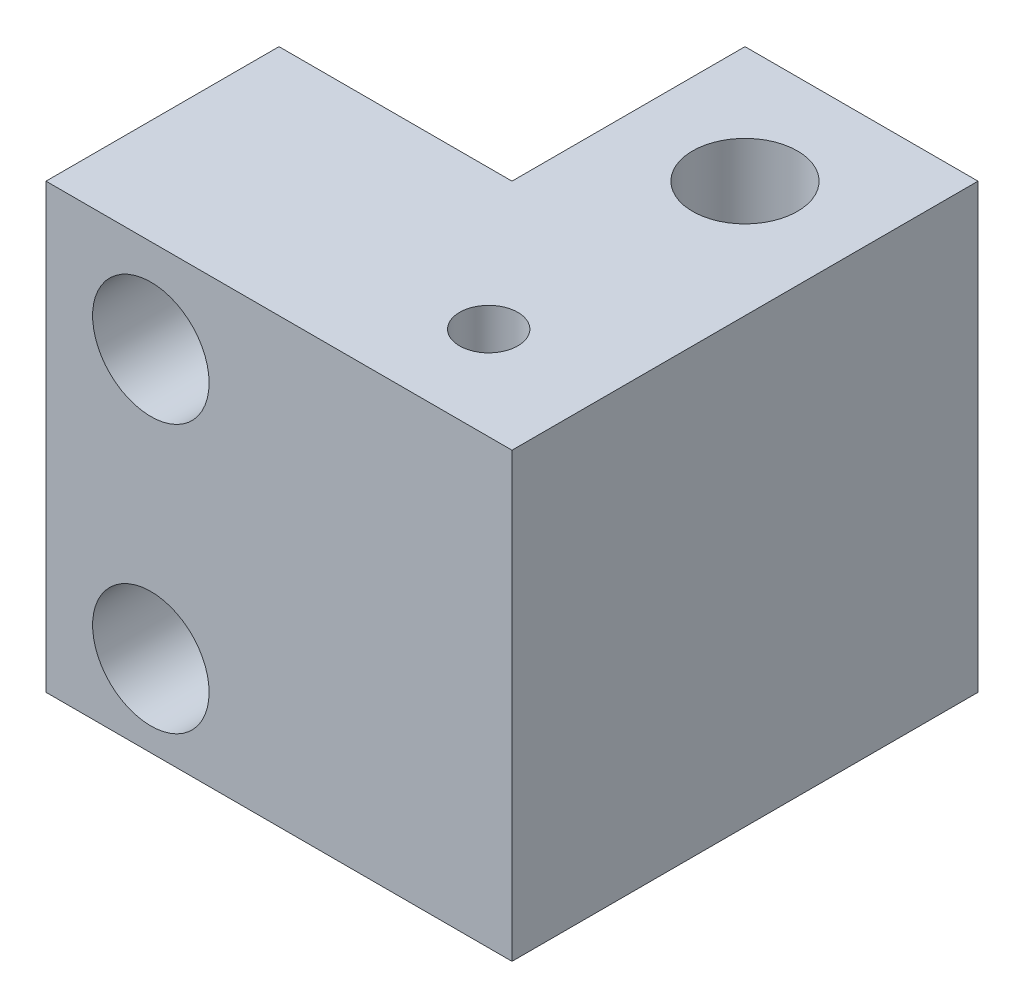
ISO-10303-21;
HEADER;
FILE_DESCRIPTION(('STEP AP214'),'2;1');
FILE_NAME('part.step','',(''),(''),'','','');
FILE_SCHEMA(('AUTOMOTIVE_DESIGN { 1 0 10303 214 1 1 1 1 }'));
ENDSEC;
DATA;
#1=APPLICATION_CONTEXT('core data for automotive mechanical design processes');
#2=APPLICATION_PROTOCOL_DEFINITION('international standard','automotive_design',2000,#1);
#3=PRODUCT_CONTEXT('',#1,'mechanical');
#4=PRODUCT('Part','Part','',(#3));
#5=PRODUCT_RELATED_PRODUCT_CATEGORY('part','',(#4));
#6=PRODUCT_DEFINITION_FORMATION('','',#4);
#7=PRODUCT_DEFINITION_CONTEXT('part definition',#1,'design');
#8=PRODUCT_DEFINITION('design','',#6,#7);
#9=PRODUCT_DEFINITION_SHAPE('','',#8);
#10=(LENGTH_UNIT() NAMED_UNIT(*) SI_UNIT(.MILLI.,.METRE.));
#11=(NAMED_UNIT(*) PLANE_ANGLE_UNIT() SI_UNIT($,.RADIAN.));
#12=(NAMED_UNIT(*) SI_UNIT($,.STERADIAN.) SOLID_ANGLE_UNIT());
#13=UNCERTAINTY_MEASURE_WITH_UNIT(LENGTH_MEASURE(1.E-05),#10,'distance_accuracy_value','');
#14=(GEOMETRIC_REPRESENTATION_CONTEXT(3) GLOBAL_UNCERTAINTY_ASSIGNED_CONTEXT((#13)) GLOBAL_UNIT_ASSIGNED_CONTEXT((#10,
#11,#12)) REPRESENTATION_CONTEXT('',''));
#15=CARTESIAN_POINT('',(0.,0.,0.));
#16=DIRECTION('',(0.,0.,1.));
#17=DIRECTION('',(1.,0.,0.));
#18=AXIS2_PLACEMENT_3D('',#15,#16,#17);
#19=CARTESIAN_POINT('',(-5.,10.75546678755,-5.));
#20=DIRECTION('',(0.,1.,0.));
#21=DIRECTION('',(0.,0.,1.));
#22=AXIS2_PLACEMENT_3D('',#19,#20,#21);
#23=CYLINDRICAL_SURFACE('',#22,2.5);
#24=CARTESIAN_POINT('',(-5.,12.5,-5.));
#25=DIRECTION('',(0.,1.,0.));
#26=DIRECTION('',(0.,0.,-1.));
#27=AXIS2_PLACEMENT_3D('',#24,#25,#26);
#28=CIRCLE('',#27,2.5);
#29=CARTESIAN_POINT('',(-5.,12.5,-7.5));
#30=VERTEX_POINT('',#29);
#31=EDGE_CURVE('P0_E11',#30,#30,#28,.T.);
#32=ORIENTED_EDGE('',*,*,#31,.T.);
#33=CARTESIAN_POINT('',(-5.00000000000001,19.,-7.5));
#34=DIRECTION('',(0.,-1.,0.));
#35=VECTOR('',#34,1.);
#36=LINE('',#33,#35);
#37=CARTESIAN_POINT('',(-5.,19.,-7.5));
#38=VERTEX_POINT('',#37);
#39=EDGE_CURVE('P0_E27',#38,#30,#36,.T.);
#40=ORIENTED_EDGE('',*,*,#39,.F.);
#41=CARTESIAN_POINT('',(-5.,19.,-5.));
#42=DIRECTION('',(0.,-1.,0.));
#43=DIRECTION('',(0.,0.,-1.));
#44=AXIS2_PLACEMENT_3D('',#41,#42,#43);
#45=CIRCLE('',#44,2.5);
#46=EDGE_CURVE('P0_E43',#38,#38,#45,.T.);
#47=ORIENTED_EDGE('',*,*,#46,.T.);
#48=ORIENTED_EDGE('',*,*,#39,.T.);
#49=EDGE_LOOP('',(#32,#40,#47,#48));
#50=FACE_BOUND('',#49,.T.);
#51=ADVANCED_FACE('P0_F16',(#50),#23,.T.);
#52=CARTESIAN_POINT('',(-5.,12.5,-5.));
#53=DIRECTION('',(0.,1.,0.));
#54=DIRECTION('',(1.,0.,0.));
#55=AXIS2_PLACEMENT_3D('',#52,#53,#54);
#56=PLANE('',#55);
#57=ORIENTED_EDGE('',*,*,#31,.F.);
#58=EDGE_LOOP('',(#57));
#59=FACE_BOUND('',#58,.T.);
#60=CARTESIAN_POINT('',(-2.75,12.5,-5.));
#61=CARTESIAN_POINT('',(-2.75,12.5,-5.42973854945374));
#62=CARTESIAN_POINT('',(-2.90797632260953,12.5,-5.82821309651421));
#63=CARTESIAN_POINT('',(-3.08010532429531,12.5,-6.26238591969255));
#64=CARTESIAN_POINT('',(-3.40900974233027,12.5,-6.59099025766973));
#65=CARTESIAN_POINT('',(-3.73935728169476,12.5,-6.92103640032665));
#66=CARTESIAN_POINT('',(-4.17178690348579,12.5,-7.09202367739047));
#67=CARTESIAN_POINT('',(-4.5718045358175,12.5,-7.25019490869194));
#68=CARTESIAN_POINT('',(-5.,12.5,-7.25));
#69=CARTESIAN_POINT('',(-5.43023270318849,12.5,-7.24980416398486));
#70=CARTESIAN_POINT('',(-5.82821309651422,12.5,-7.09202367739047));
#71=CARTESIAN_POINT('',(-6.26238605069376,12.5,-6.91989454458542));
#72=CARTESIAN_POINT('',(-6.59099025766973,12.5,-6.59099025766973));
#73=CARTESIAN_POINT('',(-6.92103640338351,12.5,-6.26064271524402));
#74=CARTESIAN_POINT('',(-7.09202367739047,12.5,-5.82821309651422));
#75=CARTESIAN_POINT('',(-7.25,12.5,-5.4286883871397));
#76=CARTESIAN_POINT('',(-7.25,12.5,-5.));
#77=B_SPLINE_CURVE_WITH_KNOTS('',2,(#60,#61,#62,#63,#64,#65,#66,#67,#68,#69,#70,#71,#72,#73,#74,
#75,#76),.UNSPECIFIED.,.F.,.F.,(3,2,2,2,2,2,2,2,3),(0.,0.125,0.25,0.375,0.5,0.625,0.75,0.875,
1.),.UNSPECIFIED.);
#78=CARTESIAN_POINT('',(-7.25,12.5,-5.));
#79=VERTEX_POINT('',#78);
#80=CARTESIAN_POINT('',(-2.75,12.5,-5.));
#81=VERTEX_POINT('',#80);
#82=EDGE_CURVE('P0_E44',#79,#81,#77,.F.);
#83=ORIENTED_EDGE('',*,*,#82,.F.);
#84=CARTESIAN_POINT('',(-7.25,12.5,-5.));
#85=CARTESIAN_POINT('',(-7.25,12.5,-4.57026145054504));
#86=CARTESIAN_POINT('',(-7.09202367739047,12.5,-4.17178690348578));
#87=CARTESIAN_POINT('',(-6.91989467570396,12.5,-3.73761408030693));
#88=CARTESIAN_POINT('',(-6.59099025766973,12.5,-3.40900974233027));
#89=CARTESIAN_POINT('',(-6.2606427183041,12.5,-3.078963599672));
#90=CARTESIAN_POINT('',(-5.82821309651421,12.5,-2.90797632260953));
#91=CARTESIAN_POINT('',(-5.42819546417947,12.5,-2.7498050913077));
#92=CARTESIAN_POINT('',(-5.,12.5,-2.75));
#93=CARTESIAN_POINT('',(-4.56976729681021,12.5,-2.75019583601551));
#94=CARTESIAN_POINT('',(-4.17178690348579,12.5,-2.90797632260953));
#95=CARTESIAN_POINT('',(-3.73761394930923,12.5,-3.08010545541356));
#96=CARTESIAN_POINT('',(-3.40900974233027,12.5,-3.40900974233027));
#97=CARTESIAN_POINT('',(-3.07896359661796,12.5,-3.73935728475253));
#98=CARTESIAN_POINT('',(-2.90797632260953,12.5,-4.17178690348579));
#99=CARTESIAN_POINT('',(-2.75,12.5,-4.57131161286009));
#100=CARTESIAN_POINT('',(-2.75,12.5,-5.));
#101=B_SPLINE_CURVE_WITH_KNOTS('',2,(#84,#85,#86,#87,#88,#89,#90,#91,#92,#93,#94,#95,#96,#97,
#98,#99,#100),.UNSPECIFIED.,.F.,.F.,(3,2,2,2,2,2,2,2,3),(0.,0.125,0.25,0.375,0.5,0.625,0.75,
0.875,1.),.UNSPECIFIED.);
#102=EDGE_CURVE('P0_E39',#81,#79,#101,.F.);
#103=ORIENTED_EDGE('',*,*,#102,.F.);
#104=EDGE_LOOP('',(#83,#103));
#105=FACE_BOUND('',#104,.T.);
#106=ADVANCED_FACE('P0_F17',(#59,#105),#56,.F.);
#107=OPEN_SHELL('',(#51,#106));
#108=SHELL_BASED_SURFACE_MODEL('P0_B1',(#107));
#109=CARTESIAN_POINT('',(-5.,12.43637043753,6.));
#110=DIRECTION('',(0.,1.,0.));
#111=DIRECTION('',(0.,0.,1.));
#112=AXIS2_PLACEMENT_3D('',#109,#110,#111);
#113=CYLINDRICAL_SURFACE('',#112,1.5);
#114=CARTESIAN_POINT('',(-5.,13.5,6.));
#115=DIRECTION('',(0.,1.,0.));
#116=DIRECTION('',(0.,0.,-1.));
#117=AXIS2_PLACEMENT_3D('',#114,#115,#116);
#118=CIRCLE('',#117,1.5);
#119=CARTESIAN_POINT('',(-5.,13.5,4.5));
#120=VERTEX_POINT('',#119);
#121=EDGE_CURVE('P1_E11',#120,#120,#118,.T.);
#122=ORIENTED_EDGE('',*,*,#121,.T.);
#123=CARTESIAN_POINT('',(-5.,19.,4.5));
#124=DIRECTION('',(0.,-1.,0.));
#125=VECTOR('',#124,1.);
#126=LINE('',#123,#125);
#127=CARTESIAN_POINT('',(-5.,19.,4.5));
#128=VERTEX_POINT('',#127);
#129=EDGE_CURVE('P1_E27',#128,#120,#126,.T.);
#130=ORIENTED_EDGE('',*,*,#129,.F.);
#131=CARTESIAN_POINT('',(-5.,19.,6.));
#132=DIRECTION('',(0.,-1.,0.));
#133=DIRECTION('',(0.,0.,-1.));
#134=AXIS2_PLACEMENT_3D('',#131,#132,#133);
#135=CIRCLE('',#134,1.5);
#136=EDGE_CURVE('P1_E43',#128,#128,#135,.T.);
#137=ORIENTED_EDGE('',*,*,#136,.T.);
#138=ORIENTED_EDGE('',*,*,#129,.T.);
#139=EDGE_LOOP('',(#122,#130,#137,#138));
#140=FACE_BOUND('',#139,.T.);
#141=ADVANCED_FACE('P1_F16',(#140),#113,.T.);
#142=CARTESIAN_POINT('',(-5.,13.5,6.));
#143=DIRECTION('',(0.,1.,0.));
#144=DIRECTION('',(1.,0.,0.));
#145=AXIS2_PLACEMENT_3D('',#142,#143,#144);
#146=PLANE('',#145);
#147=ORIENTED_EDGE('',*,*,#121,.F.);
#148=EDGE_LOOP('',(#147));
#149=FACE_BOUND('',#148,.T.);
#150=CARTESIAN_POINT('',(-3.75,13.5,6.));
#151=CARTESIAN_POINT('',(-3.75,13.5,5.76100564294309));
#152=CARTESIAN_POINT('',(-3.83776462367196,13.5,5.53988161304766));
#153=CARTESIAN_POINT('',(-3.93365902356337,13.5,5.29827451372653));
#154=CARTESIAN_POINT('',(-4.11611652351681,13.5,5.11611652351681));
#155=CARTESIAN_POINT('',(-4.30001758597357,13.5,4.93251734045716));
#156=CARTESIAN_POINT('',(-4.53988161304766,13.5,4.83776462367196));
#157=CARTESIAN_POINT('',(-4.76254795374342,13.5,4.7498054537418));
#158=CARTESIAN_POINT('',(-5.,13.5,4.75));
#159=CARTESIAN_POINT('',(-5.23948905399546,13.5,4.75019621519406));
#160=CARTESIAN_POINT('',(-5.46011838695234,13.5,4.83776462367196));
#161=CARTESIAN_POINT('',(-5.70172572372918,13.5,4.93365926140931));
#162=CARTESIAN_POINT('',(-5.88388347648319,13.5,5.11611652351681));
#163=CARTESIAN_POINT('',(-6.06748266432252,13.5,5.30001759076134));
#164=CARTESIAN_POINT('',(-6.16223537632804,13.5,5.53988161304766));
#165=CARTESIAN_POINT('',(-6.25,13.5,5.76205547174604));
#166=CARTESIAN_POINT('',(-6.25,13.5,6.));
#167=B_SPLINE_CURVE_WITH_KNOTS('',2,(#150,#151,#152,#153,#154,#155,#156,#157,#158,#159,#160,
#161,#162,#163,#164,#165,#166),.UNSPECIFIED.,.F.,.F.,(3,2,2,2,2,2,2,2,3),(0.,0.125,0.25,0.375,
0.5,0.625,0.75,0.875,1.),.UNSPECIFIED.);
#168=CARTESIAN_POINT('',(-6.25,13.5,6.));
#169=VERTEX_POINT('',#168);
#170=CARTESIAN_POINT('',(-3.75,13.5,6.));
#171=VERTEX_POINT('',#170);
#172=EDGE_CURVE('P1_E44',#169,#171,#167,.F.);
#173=ORIENTED_EDGE('',*,*,#172,.F.);
#174=CARTESIAN_POINT('',(-6.25,13.5,6.));
#175=CARTESIAN_POINT('',(-6.25,13.5,6.23899435706058));
#176=CARTESIAN_POINT('',(-6.16223537632804,13.5,6.46011838695234));
#177=CARTESIAN_POINT('',(-6.06634097643341,13.5,6.70172548627756));
#178=CARTESIAN_POINT('',(-5.88388347648318,13.5,6.88388347648319));
#179=CARTESIAN_POINT('',(-5.69998241402487,13.5,7.06748265954348));
#180=CARTESIAN_POINT('',(-5.46011838695234,13.5,7.16223537632804));
#181=CARTESIAN_POINT('',(-5.23745204625651,13.5,7.25019454625821));
#182=CARTESIAN_POINT('',(-5.,13.5,7.25));
#183=CARTESIAN_POINT('',(-4.76051094600391,13.5,7.24980378480594));
#184=CARTESIAN_POINT('',(-4.53988161304766,13.5,7.16223537632804));
#185=CARTESIAN_POINT('',(-4.29827427626999,13.5,7.06634073859009));
#186=CARTESIAN_POINT('',(-4.11611652351682,13.5,6.88388347648319));
#187=CARTESIAN_POINT('',(-3.93251733567698,13.5,6.69998240923792));
#188=CARTESIAN_POINT('',(-3.83776462367196,13.5,6.46011838695234));
#189=CARTESIAN_POINT('',(-3.75,13.5,6.23794452825349));
#190=CARTESIAN_POINT('',(-3.75,13.5,6.));
#191=B_SPLINE_CURVE_WITH_KNOTS('',2,(#174,#175,#176,#177,#178,#179,#180,#181,#182,#183,#184,
#185,#186,#187,#188,#189,#190),.UNSPECIFIED.,.F.,.F.,(3,2,2,2,2,2,2,2,3),(0.,0.125,0.25,0.375,
0.5,0.625,0.75,0.875,1.),.UNSPECIFIED.);
#192=EDGE_CURVE('P1_E39',#171,#169,#191,.F.);
#193=ORIENTED_EDGE('',*,*,#192,.F.);
#194=EDGE_LOOP('',(#173,#193));
#195=FACE_BOUND('',#194,.T.);
#196=ADVANCED_FACE('P1_F17',(#149,#195),#146,.F.);
#197=OPEN_SHELL('',(#141,#196));
#198=SHELL_BASED_SURFACE_MODEL('P1_B1',(#197));
#199=CARTESIAN_POINT('',(-20.,19.,0.));
#200=DIRECTION('',(-1.,0.,0.));
#201=DIRECTION('',(0.,0.,1.));
#202=AXIS2_PLACEMENT_3D('',#199,#200,#201);
#203=PLANE('',#202);
#204=DIRECTION('',(0.,0.,1.));
#205=VECTOR('',#204,1.);
#206=CARTESIAN_POINT('',(-20.,19.,0.));
#207=LINE('',#206,#205);
#208=CARTESIAN_POINT('',(-20.,19.,0.));
#209=VERTEX_POINT('',#208);
#210=CARTESIAN_POINT('',(-20.,19.,10.));
#211=VERTEX_POINT('',#210);
#212=EDGE_CURVE('P2_E131',#209,#211,#207,.T.);
#213=ORIENTED_EDGE('',*,*,#212,.F.);
#214=DIRECTION('',(0.,-1.,0.));
#215=VECTOR('',#214,1.);
#216=CARTESIAN_POINT('',(-20.,0.,0.));
#217=LINE('',#216,#215);
#218=CARTESIAN_POINT('',(-20.,0.,0.));
#219=VERTEX_POINT('',#218);
#220=EDGE_CURVE('P2_E28',#209,#219,#217,.T.);
#221=ORIENTED_EDGE('',*,*,#220,.T.);
#222=DIRECTION('',(0.,0.,-1.));
#223=VECTOR('',#222,1.);
#224=CARTESIAN_POINT('',(-20.,0.,0.));
#225=LINE('',#224,#223);
#226=CARTESIAN_POINT('',(-20.,0.,10.));
#227=VERTEX_POINT('',#226);
#228=EDGE_CURVE('P2_E134',#227,#219,#225,.T.);
#229=ORIENTED_EDGE('',*,*,#228,.F.);
#230=DIRECTION('',(0.,-1.,0.));
#231=VECTOR('',#230,1.);
#232=CARTESIAN_POINT('',(-20.,0.,10.));
#233=LINE('',#232,#231);
#234=EDGE_CURVE('P2_E130',#211,#227,#233,.T.);
#235=ORIENTED_EDGE('',*,*,#234,.F.);
#236=EDGE_LOOP('',(#213,#221,#229,#235));
#237=FACE_BOUND('',#236,.T.);
#238=ADVANCED_FACE('P2_F17',(#237),#203,.T.);
#239=CARTESIAN_POINT('',(-10.,0.,0.));
#240=DIRECTION('',(-1.,0.,0.));
#241=DIRECTION('',(0.,0.,1.));
#242=AXIS2_PLACEMENT_3D('',#239,#240,#241);
#243=PLANE('',#242);
#244=DIRECTION('',(0.,0.,-1.));
#245=VECTOR('',#244,1.);
#246=CARTESIAN_POINT('',(-10.,0.,0.));
#247=LINE('',#246,#245);
#248=CARTESIAN_POINT('',(-10.,0.,0.));
#249=VERTEX_POINT('',#248);
#250=CARTESIAN_POINT('',(-10.,0.,-10.));
#251=VERTEX_POINT('',#250);
#252=EDGE_CURVE('P2_E122',#249,#251,#247,.T.);
#253=ORIENTED_EDGE('',*,*,#252,.F.);
#254=DIRECTION('',(0.,1.,0.));
#255=VECTOR('',#254,1.);
#256=CARTESIAN_POINT('',(-10.,0.,0.));
#257=LINE('',#256,#255);
#258=CARTESIAN_POINT('',(-10.,19.,0.));
#259=VERTEX_POINT('',#258);
#260=EDGE_CURVE('P2_E11',#249,#259,#257,.T.);
#261=ORIENTED_EDGE('',*,*,#260,.T.);
#262=DIRECTION('',(0.,0.,1.));
#263=VECTOR('',#262,1.);
#264=CARTESIAN_POINT('',(-10.,19.,0.));
#265=LINE('',#264,#263);
#266=CARTESIAN_POINT('',(-10.,19.,-10.));
#267=VERTEX_POINT('',#266);
#268=EDGE_CURVE('P2_E154',#267,#259,#265,.T.);
#269=ORIENTED_EDGE('',*,*,#268,.F.);
#270=DIRECTION('',(0.,1.,0.));
#271=VECTOR('',#270,1.);
#272=CARTESIAN_POINT('',(-10.,0.,-10.));
#273=LINE('',#272,#271);
#274=EDGE_CURVE('P2_E172',#251,#267,#273,.T.);
#275=ORIENTED_EDGE('',*,*,#274,.F.);
#276=EDGE_LOOP('',(#253,#261,#269,#275));
#277=FACE_BOUND('',#276,.T.);
#278=ADVANCED_FACE('P2_F277',(#277),#243,.T.);
#279=CARTESIAN_POINT('',(0.,0.,0.));
#280=DIRECTION('',(0.,0.,1.));
#281=DIRECTION('',(1.,0.,0.));
#282=AXIS2_PLACEMENT_3D('',#279,#280,#281);
#283=PLANE('',#282);
#284=CARTESIAN_POINT('',(-15.5,3.5,0.));
#285=DIRECTION('',(0.,0.,-1.));
#286=DIRECTION('',(-1.,0.,0.));
#287=AXIS2_PLACEMENT_3D('',#284,#285,#286);
#288=CIRCLE('',#287,2.5);
#289=CARTESIAN_POINT('',(-13.,3.5,0.));
#290=VERTEX_POINT('',#289);
#291=EDGE_CURVE('P2_E206',#290,#290,#288,.T.);
#292=ORIENTED_EDGE('',*,*,#291,.F.);
#293=EDGE_LOOP('',(#292));
#294=FACE_BOUND('',#293,.T.);
#295=CARTESIAN_POINT('',(-15.5,15.,0.));
#296=DIRECTION('',(0.,0.,-1.));
#297=DIRECTION('',(-1.,0.,0.));
#298=AXIS2_PLACEMENT_3D('',#295,#296,#297);
#299=CIRCLE('',#298,2.5);
#300=CARTESIAN_POINT('',(-13.,15.,0.));
#301=VERTEX_POINT('',#300);
#302=EDGE_CURVE('P2_E21',#301,#301,#299,.T.);
#303=ORIENTED_EDGE('',*,*,#302,.F.);
#304=EDGE_LOOP('',(#303));
#305=FACE_BOUND('',#304,.T.);
#306=ORIENTED_EDGE('',*,*,#220,.F.);
#307=DIRECTION('',(-1.,0.,0.));
#308=VECTOR('',#307,1.);
#309=CARTESIAN_POINT('',(0.,19.,0.));
#310=LINE('',#309,#308);
#311=EDGE_CURVE('P2_E147',#259,#209,#310,.T.);
#312=ORIENTED_EDGE('',*,*,#311,.F.);
#313=ORIENTED_EDGE('',*,*,#260,.F.);
#314=DIRECTION('',(1.,0.,0.));
#315=VECTOR('',#314,1.);
#316=CARTESIAN_POINT('',(-20.,0.,0.));
#317=LINE('',#316,#315);
#318=EDGE_CURVE('P2_E211',#219,#249,#317,.T.);
#319=ORIENTED_EDGE('',*,*,#318,.F.);
#320=EDGE_LOOP('',(#306,#312,#313,#319));
#321=FACE_BOUND('',#320,.T.);
#322=ADVANCED_FACE('P2_F282',(#294,#305,#321),#283,.F.);
#323=CARTESIAN_POINT('',(0.,0.,10.));
#324=DIRECTION('',(0.,0.,1.));
#325=DIRECTION('',(1.,0.,0.));
#326=AXIS2_PLACEMENT_3D('',#323,#324,#325);
#327=PLANE('',#326);
#328=CARTESIAN_POINT('',(-15.5,3.5,10.));
#329=DIRECTION('',(0.,0.,-1.));
#330=DIRECTION('',(-1.,0.,0.));
#331=AXIS2_PLACEMENT_3D('',#328,#329,#330);
#332=CIRCLE('',#331,2.5);
#333=CARTESIAN_POINT('',(-13.,3.5,10.));
#334=VERTEX_POINT('',#333);
#335=EDGE_CURVE('P2_E240',#334,#334,#332,.T.);
#336=ORIENTED_EDGE('',*,*,#335,.T.);
#337=EDGE_LOOP('',(#336));
#338=FACE_BOUND('',#337,.T.);
#339=CARTESIAN_POINT('',(-15.5,15.,10.));
#340=DIRECTION('',(0.,0.,-1.));
#341=DIRECTION('',(-1.,0.,0.));
#342=AXIS2_PLACEMENT_3D('',#339,#340,#341);
#343=CIRCLE('',#342,2.5);
#344=CARTESIAN_POINT('',(-13.,15.,10.));
#345=VERTEX_POINT('',#344);
#346=EDGE_CURVE('P2_E189',#345,#345,#343,.T.);
#347=ORIENTED_EDGE('',*,*,#346,.T.);
#348=EDGE_LOOP('',(#347));
#349=FACE_BOUND('',#348,.T.);
#350=DIRECTION('',(-1.,0.,0.));
#351=VECTOR('',#350,1.);
#352=CARTESIAN_POINT('',(-20.,0.,10.));
#353=LINE('',#352,#351);
#354=CARTESIAN_POINT('',(0.,0.,10.));
#355=VERTEX_POINT('',#354);
#356=EDGE_CURVE('P2_E174',#355,#227,#353,.T.);
#357=ORIENTED_EDGE('',*,*,#356,.F.);
#358=DIRECTION('',(0.,-1.,0.));
#359=VECTOR('',#358,1.);
#360=CARTESIAN_POINT('',(0.,0.,10.));
#361=LINE('',#360,#359);
#362=CARTESIAN_POINT('',(0.,19.,10.));
#363=VERTEX_POINT('',#362);
#364=EDGE_CURVE('P2_E141',#363,#355,#361,.T.);
#365=ORIENTED_EDGE('',*,*,#364,.F.);
#366=DIRECTION('',(1.,0.,0.));
#367=VECTOR('',#366,1.);
#368=CARTESIAN_POINT('',(0.,19.,10.));
#369=LINE('',#368,#367);
#370=EDGE_CURVE('P2_E96',#211,#363,#369,.T.);
#371=ORIENTED_EDGE('',*,*,#370,.F.);
#372=ORIENTED_EDGE('',*,*,#234,.T.);
#373=EDGE_LOOP('',(#357,#365,#371,#372));
#374=FACE_BOUND('',#373,.T.);
#375=ADVANCED_FACE('P2_F139',(#338,#349,#374),#327,.T.);
#376=CARTESIAN_POINT('',(-20.,0.,0.));
#377=DIRECTION('',(0.,-1.,0.));
#378=DIRECTION('',(0.,0.,-1.));
#379=AXIS2_PLACEMENT_3D('',#376,#377,#378);
#380=PLANE('',#379);
#381=DIRECTION('',(-1.,0.,0.));
#382=VECTOR('',#381,1.);
#383=CARTESIAN_POINT('',(0.,0.,-10.));
#384=LINE('',#383,#382);
#385=CARTESIAN_POINT('',(0.,0.,-10.));
#386=VERTEX_POINT('',#385);
#387=EDGE_CURVE('P2_E175',#386,#251,#384,.T.);
#388=ORIENTED_EDGE('',*,*,#387,.F.);
#389=DIRECTION('',(0.,0.,-1.));
#390=VECTOR('',#389,1.);
#391=CARTESIAN_POINT('',(0.,0.,0.));
#392=LINE('',#391,#390);
#393=EDGE_CURVE('P2_E168',#355,#386,#392,.T.);
#394=ORIENTED_EDGE('',*,*,#393,.F.);
#395=ORIENTED_EDGE('',*,*,#356,.T.);
#396=ORIENTED_EDGE('',*,*,#228,.T.);
#397=ORIENTED_EDGE('',*,*,#318,.T.);
#398=ORIENTED_EDGE('',*,*,#252,.T.);
#399=EDGE_LOOP('',(#388,#394,#395,#396,#397,#398));
#400=FACE_BOUND('',#399,.T.);
#401=ADVANCED_FACE('P2_F290',(#400),#380,.T.);
#402=CARTESIAN_POINT('',(0.,0.,-10.));
#403=DIRECTION('',(0.,0.,-1.));
#404=DIRECTION('',(0.,-1.,0.));
#405=AXIS2_PLACEMENT_3D('',#402,#403,#404);
#406=PLANE('',#405);
#407=ORIENTED_EDGE('',*,*,#387,.T.);
#408=ORIENTED_EDGE('',*,*,#274,.T.);
#409=DIRECTION('',(-1.,0.,0.));
#410=VECTOR('',#409,1.);
#411=CARTESIAN_POINT('',(0.,19.,-10.));
#412=LINE('',#411,#410);
#413=CARTESIAN_POINT('',(0.,19.,-10.));
#414=VERTEX_POINT('',#413);
#415=EDGE_CURVE('P2_E108',#414,#267,#412,.T.);
#416=ORIENTED_EDGE('',*,*,#415,.F.);
#417=DIRECTION('',(0.,1.,0.));
#418=VECTOR('',#417,1.);
#419=CARTESIAN_POINT('',(0.,0.,-10.));
#420=LINE('',#419,#418);
#421=EDGE_CURVE('P2_E166',#386,#414,#420,.T.);
#422=ORIENTED_EDGE('',*,*,#421,.F.);
#423=EDGE_LOOP('',(#407,#408,#416,#422));
#424=FACE_BOUND('',#423,.T.);
#425=ADVANCED_FACE('P2_F293',(#424),#406,.T.);
#426=CARTESIAN_POINT('',(0.,19.,0.));
#427=DIRECTION('',(0.,1.,0.));
#428=DIRECTION('',(1.,0.,0.));
#429=AXIS2_PLACEMENT_3D('',#426,#427,#428);
#430=PLANE('',#429);
#431=CARTESIAN_POINT('',(-5.,19.,-5.));
#432=DIRECTION('',(0.,-1.,0.));
#433=DIRECTION('',(0.,0.,1.));
#434=AXIS2_PLACEMENT_3D('',#431,#432,#433);
#435=CIRCLE('',#434,2.25);
#436=CARTESIAN_POINT('',(-5.,19.,-7.25));
#437=VERTEX_POINT('',#436);
#438=EDGE_CURVE('P2_E179',#437,#437,#435,.T.);
#439=ORIENTED_EDGE('',*,*,#438,.T.);
#440=EDGE_LOOP('',(#439));
#441=FACE_BOUND('',#440,.T.);
#442=CARTESIAN_POINT('',(-5.,19.,6.));
#443=DIRECTION('',(0.,-1.,0.));
#444=DIRECTION('',(0.,0.,1.));
#445=AXIS2_PLACEMENT_3D('',#442,#443,#444);
#446=CIRCLE('',#445,1.25);
#447=CARTESIAN_POINT('',(-5.,19.,4.75));
#448=VERTEX_POINT('',#447);
#449=EDGE_CURVE('P2_E192',#448,#448,#446,.T.);
#450=ORIENTED_EDGE('',*,*,#449,.T.);
#451=EDGE_LOOP('',(#450));
#452=FACE_BOUND('',#451,.T.);
#453=ORIENTED_EDGE('',*,*,#268,.T.);
#454=ORIENTED_EDGE('',*,*,#311,.T.);
#455=ORIENTED_EDGE('',*,*,#212,.T.);
#456=ORIENTED_EDGE('',*,*,#370,.T.);
#457=DIRECTION('',(0.,0.,1.));
#458=VECTOR('',#457,1.);
#459=CARTESIAN_POINT('',(0.,19.,0.));
#460=LINE('',#459,#458);
#461=EDGE_CURVE('P2_E202',#414,#363,#460,.T.);
#462=ORIENTED_EDGE('',*,*,#461,.F.);
#463=ORIENTED_EDGE('',*,*,#415,.T.);
#464=EDGE_LOOP('',(#453,#454,#455,#456,#462,#463));
#465=FACE_BOUND('',#464,.T.);
#466=ADVANCED_FACE('P2_F146',(#441,#452,#465),#430,.T.);
#467=CARTESIAN_POINT('',(0.,0.,0.));
#468=DIRECTION('',(1.,0.,0.));
#469=DIRECTION('',(0.,1.,0.));
#470=AXIS2_PLACEMENT_3D('',#467,#468,#469);
#471=PLANE('',#470);
#472=ORIENTED_EDGE('',*,*,#421,.T.);
#473=ORIENTED_EDGE('',*,*,#461,.T.);
#474=ORIENTED_EDGE('',*,*,#364,.T.);
#475=ORIENTED_EDGE('',*,*,#393,.T.);
#476=EDGE_LOOP('',(#472,#473,#474,#475));
#477=FACE_BOUND('',#476,.T.);
#478=ADVANCED_FACE('P2_F273',(#477),#471,.T.);
#479=CARTESIAN_POINT('',(-5.,12.4999999999886,-5.));
#480=DIRECTION('',(0.,1.,0.));
#481=DIRECTION('',(0.,0.,1.));
#482=AXIS2_PLACEMENT_3D('',#479,#480,#481);
#483=CONICAL_SURFACE('',#482,2.25000000000819,1.02974425858935);
#484=DIRECTION('',(0.,0.515038074984888,-0.857167300657148));
#485=VECTOR('',#484,1.);
#486=CARTESIAN_POINT('',(-5.,12.4999999999886,-7.25000000000819));
#487=LINE('',#486,#485);
#488=CARTESIAN_POINT('',(-5.,11.1480636069044,-5.));
#489=VERTEX_POINT('',#488);
#490=CARTESIAN_POINT('',(-5.,12.5,-7.25));
#491=VERTEX_POINT('',#490);
#492=EDGE_CURVE('P2_E162',#489,#491,#487,.T.);
#493=ORIENTED_EDGE('',*,*,#492,.T.);
#494=CARTESIAN_POINT('',(-5.,12.5,-5.));
#495=DIRECTION('',(0.,1.,0.));
#496=DIRECTION('',(0.,0.,1.));
#497=AXIS2_PLACEMENT_3D('',#494,#495,#496);
#498=CIRCLE('',#497,2.25);
#499=EDGE_CURVE('P2_E180',#491,#491,#498,.T.);
#500=ORIENTED_EDGE('',*,*,#499,.T.);
#501=ORIENTED_EDGE('',*,*,#492,.F.);
#502=EDGE_LOOP('',(#493,#500,#501));
#503=FACE_BOUND('',#502,.T.);
#504=ADVANCED_FACE('P2_F19',(#503),#483,.F.);
#505=CARTESIAN_POINT('',(-5.,13.4999999999081,6.));
#506=DIRECTION('',(0.,1.,0.));
#507=DIRECTION('',(0.,0.,1.));
#508=AXIS2_PLACEMENT_3D('',#505,#506,#507);
#509=CONICAL_SURFACE('',#508,1.24999999980446,1.02974425847106);
#510=DIRECTION('',(0.,0.515038075086286,-0.857167300596222));
#511=VECTOR('',#510,1.);
#512=CARTESIAN_POINT('',(-5.,13.4999999999081,4.75000000019554));
#513=LINE('',#512,#511);
#514=CARTESIAN_POINT('',(-5.,12.7489242258914,6.));
#515=VERTEX_POINT('',#514);
#516=CARTESIAN_POINT('',(-5.,13.5,4.75));
#517=VERTEX_POINT('',#516);
#518=EDGE_CURVE('P2_E167',#515,#517,#513,.T.);
#519=ORIENTED_EDGE('',*,*,#518,.T.);
#520=CARTESIAN_POINT('',(-5.,13.5,6.));
#521=DIRECTION('',(0.,1.,0.));
#522=DIRECTION('',(0.,0.,1.));
#523=AXIS2_PLACEMENT_3D('',#520,#521,#522);
#524=CIRCLE('',#523,1.25);
#525=EDGE_CURVE('P2_E157',#517,#517,#524,.T.);
#526=ORIENTED_EDGE('',*,*,#525,.T.);
#527=ORIENTED_EDGE('',*,*,#518,.F.);
#528=EDGE_LOOP('',(#519,#526,#527));
#529=FACE_BOUND('',#528,.T.);
#530=ADVANCED_FACE('P2_F262',(#529),#509,.F.);
#531=CARTESIAN_POINT('',(-15.5,3.5,10.));
#532=DIRECTION('',(0.,0.,-1.));
#533=DIRECTION('',(-1.,0.,0.));
#534=AXIS2_PLACEMENT_3D('',#531,#532,#533);
#535=CYLINDRICAL_SURFACE('',#534,2.5);
#536=ORIENTED_EDGE('',*,*,#335,.F.);
#537=DIRECTION('',(0.,0.,-1.));
#538=VECTOR('',#537,1.);
#539=CARTESIAN_POINT('',(-13.,3.5,10.));
#540=LINE('',#539,#538);
#541=EDGE_CURVE('P2_E232',#334,#290,#540,.T.);
#542=ORIENTED_EDGE('',*,*,#541,.T.);
#543=ORIENTED_EDGE('',*,*,#291,.T.);
#544=ORIENTED_EDGE('',*,*,#541,.F.);
#545=EDGE_LOOP('',(#536,#542,#543,#544));
#546=FACE_BOUND('',#545,.T.);
#547=ADVANCED_FACE('P2_F264',(#546),#535,.F.);
#548=CARTESIAN_POINT('',(-15.5,15.,10.));
#549=DIRECTION('',(0.,0.,-1.));
#550=DIRECTION('',(-1.,0.,0.));
#551=AXIS2_PLACEMENT_3D('',#548,#549,#550);
#552=CYLINDRICAL_SURFACE('',#551,2.5);
#553=ORIENTED_EDGE('',*,*,#346,.F.);
#554=DIRECTION('',(0.,0.,-1.));
#555=VECTOR('',#554,1.);
#556=CARTESIAN_POINT('',(-13.,15.,10.));
#557=LINE('',#556,#555);
#558=EDGE_CURVE('P2_E222',#345,#301,#557,.T.);
#559=ORIENTED_EDGE('',*,*,#558,.T.);
#560=ORIENTED_EDGE('',*,*,#302,.T.);
#561=ORIENTED_EDGE('',*,*,#558,.F.);
#562=EDGE_LOOP('',(#553,#559,#560,#561));
#563=FACE_BOUND('',#562,.T.);
#564=ADVANCED_FACE('P2_F271',(#563),#552,.F.);
#565=CARTESIAN_POINT('',(-5.,10.75546678755,-5.));
#566=DIRECTION('',(0.,1.,0.));
#567=DIRECTION('',(0.,0.,1.));
#568=AXIS2_PLACEMENT_3D('',#565,#566,#567);
#569=CYLINDRICAL_SURFACE('',#568,2.25);
#570=ORIENTED_EDGE('',*,*,#499,.F.);
#571=DIRECTION('',(0.,1.,0.));
#572=VECTOR('',#571,1.);
#573=CARTESIAN_POINT('',(-5.,10.75546678755,-7.25));
#574=LINE('',#573,#572);
#575=EDGE_CURVE('P2_E176',#491,#437,#574,.T.);
#576=ORIENTED_EDGE('',*,*,#575,.T.);
#577=ORIENTED_EDGE('',*,*,#438,.F.);
#578=ORIENTED_EDGE('',*,*,#575,.F.);
#579=EDGE_LOOP('',(#570,#576,#577,#578));
#580=FACE_BOUND('',#579,.T.);
#581=ADVANCED_FACE('P2_F289',(#580),#569,.F.);
#582=CARTESIAN_POINT('',(-5.,12.43637043753,6.));
#583=DIRECTION('',(0.,1.,0.));
#584=DIRECTION('',(0.,0.,1.));
#585=AXIS2_PLACEMENT_3D('',#582,#583,#584);
#586=CYLINDRICAL_SURFACE('',#585,1.25);
#587=ORIENTED_EDGE('',*,*,#525,.F.);
#588=DIRECTION('',(0.,1.,0.));
#589=VECTOR('',#588,1.);
#590=CARTESIAN_POINT('',(-5.,12.43637043753,4.75));
#591=LINE('',#590,#589);
#592=EDGE_CURVE('P2_E161',#517,#448,#591,.T.);
#593=ORIENTED_EDGE('',*,*,#592,.T.);
#594=ORIENTED_EDGE('',*,*,#449,.F.);
#595=ORIENTED_EDGE('',*,*,#592,.F.);
#596=EDGE_LOOP('',(#587,#593,#594,#595));
#597=FACE_BOUND('',#596,.T.);
#598=ADVANCED_FACE('P2_F260',(#597),#586,.F.);
#599=CLOSED_SHELL('',(#238,#278,#322,#375,#401,#425,#466,#478,#504,#530,#547,#564,#581,#598));
#600=MANIFOLD_SOLID_BREP('P2_B1',#599);
#601=ADVANCED_BREP_SHAPE_REPRESENTATION('',(#18,#600),#14);
#602=MANIFOLD_SURFACE_SHAPE_REPRESENTATION('',(#18,#108,#198),#14);
#603=SHAPE_REPRESENTATION('',(#18),#14);
#604=SHAPE_DEFINITION_REPRESENTATION(#9,#603);
#605=SHAPE_REPRESENTATION_RELATIONSHIP('','',#603,#601);
#606=SHAPE_REPRESENTATION_RELATIONSHIP('','',#603,#602);
ENDSEC;
END-ISO-10303-21;
